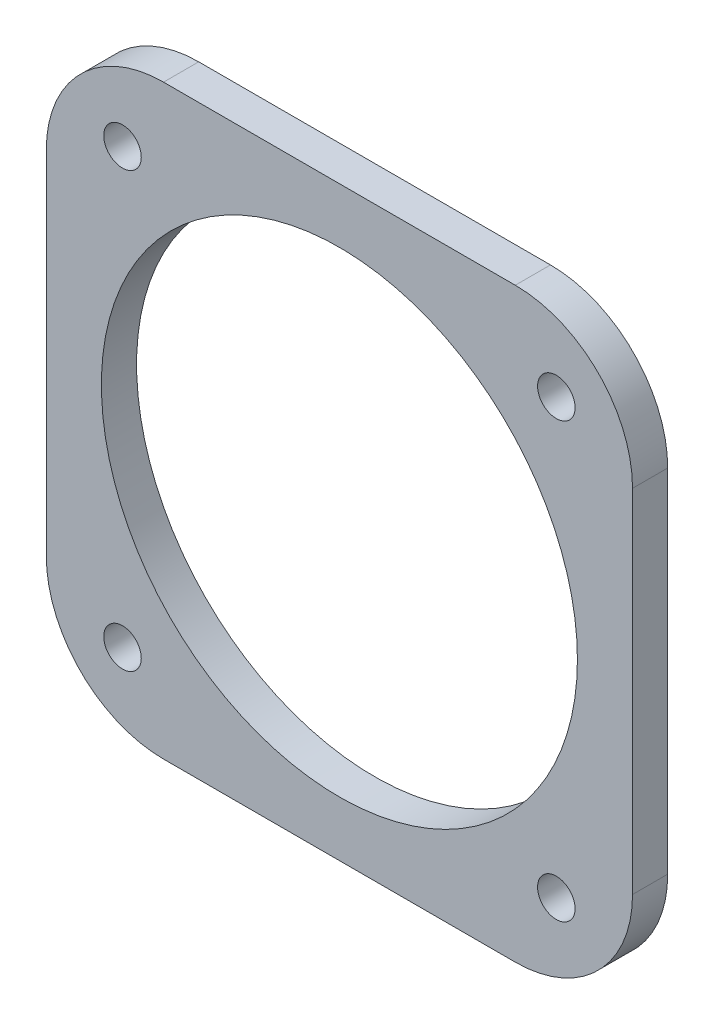
ISO-10303-21;
HEADER;
FILE_DESCRIPTION(('STEP AP214'),'2;1');
FILE_NAME('part.step','',(''),(''),'','','');
FILE_SCHEMA(('AUTOMOTIVE_DESIGN { 1 0 10303 214 1 1 1 1 }'));
ENDSEC;
DATA;
#1=APPLICATION_CONTEXT('core data for automotive mechanical design processes');
#2=APPLICATION_PROTOCOL_DEFINITION('international standard','automotive_design',2000,#1);
#3=PRODUCT_CONTEXT('',#1,'mechanical');
#4=PRODUCT('Part','Part','',(#3));
#5=PRODUCT_RELATED_PRODUCT_CATEGORY('part','',(#4));
#6=PRODUCT_DEFINITION_FORMATION('','',#4);
#7=PRODUCT_DEFINITION_CONTEXT('part definition',#1,'design');
#8=PRODUCT_DEFINITION('design','',#6,#7);
#9=PRODUCT_DEFINITION_SHAPE('','',#8);
#10=(LENGTH_UNIT() NAMED_UNIT(*) SI_UNIT(.MILLI.,.METRE.));
#11=(NAMED_UNIT(*) PLANE_ANGLE_UNIT() SI_UNIT($,.RADIAN.));
#12=(NAMED_UNIT(*) SI_UNIT($,.STERADIAN.) SOLID_ANGLE_UNIT());
#13=UNCERTAINTY_MEASURE_WITH_UNIT(LENGTH_MEASURE(1.E-05),#10,'distance_accuracy_value','');
#14=(GEOMETRIC_REPRESENTATION_CONTEXT(3) GLOBAL_UNCERTAINTY_ASSIGNED_CONTEXT((#13)) GLOBAL_UNIT_ASSIGNED_CONTEXT((#10,
#11,#12)) REPRESENTATION_CONTEXT('',''));
#15=CARTESIAN_POINT('',(0.,0.,0.));
#16=DIRECTION('',(0.,0.,1.));
#17=DIRECTION('',(1.,0.,0.));
#18=AXIS2_PLACEMENT_3D('',#15,#16,#17);
#19=CARTESIAN_POINT('',(0.,0.,3.));
#20=DIRECTION('',(0.,0.,1.));
#21=DIRECTION('',(1.,0.,0.));
#22=AXIS2_PLACEMENT_3D('',#19,#20,#21);
#23=PLANE('',#22);
#24=CARTESIAN_POINT('',(18.5000000000011,-18.499999999999,3.));
#25=DIRECTION('',(0.,0.,1.));
#26=DIRECTION('',(1.,0.,0.));
#27=AXIS2_PLACEMENT_3D('',#24,#25,#26);
#28=CIRCLE('',#27,1.6);
#29=CARTESIAN_POINT('',(20.100000000001,-18.499999999999,3.));
#30=VERTEX_POINT('',#29);
#31=EDGE_CURVE('E193',#30,#30,#28,.T.);
#32=ORIENTED_EDGE('',*,*,#31,.F.);
#33=EDGE_LOOP('',(#32));
#34=FACE_BOUND('',#33,.T.);
#35=CARTESIAN_POINT('',(-18.5,18.5,3.));
#36=DIRECTION('',(0.,0.,1.));
#37=DIRECTION('',(1.,0.,0.));
#38=AXIS2_PLACEMENT_3D('',#35,#36,#37);
#39=CIRCLE('',#38,1.6);
#40=CARTESIAN_POINT('',(-16.9,18.5,3.));
#41=VERTEX_POINT('',#40);
#42=EDGE_CURVE('E181',#41,#41,#39,.T.);
#43=ORIENTED_EDGE('',*,*,#42,.F.);
#44=EDGE_LOOP('',(#43));
#45=FACE_BOUND('',#44,.T.);
#46=DIRECTION('',(0.,1.,0.));
#47=VECTOR('',#46,1.);
#48=CARTESIAN_POINT('',(25.,25.,3.));
#49=LINE('',#48,#47);
#50=CARTESIAN_POINT('',(25.,-15.,3.));
#51=VERTEX_POINT('',#50);
#52=CARTESIAN_POINT('',(25.,15.,3.));
#53=VERTEX_POINT('',#52);
#54=EDGE_CURVE('E138',#51,#53,#49,.T.);
#55=ORIENTED_EDGE('',*,*,#54,.T.);
#56=CARTESIAN_POINT('',(15.,15.,3.));
#57=DIRECTION('',(0.,0.,1.));
#58=DIRECTION('',(1.,0.,0.));
#59=AXIS2_PLACEMENT_3D('',#56,#57,#58);
#60=CIRCLE('',#59,10.);
#61=CARTESIAN_POINT('',(15.,25.,3.));
#62=VERTEX_POINT('',#61);
#63=EDGE_CURVE('E153',#53,#62,#60,.T.);
#64=ORIENTED_EDGE('',*,*,#63,.T.);
#65=DIRECTION('',(-1.,0.,0.));
#66=VECTOR('',#65,1.);
#67=CARTESIAN_POINT('',(-25.,25.,3.));
#68=LINE('',#67,#66);
#69=CARTESIAN_POINT('',(-15.,25.,3.));
#70=VERTEX_POINT('',#69);
#71=EDGE_CURVE('E120',#62,#70,#68,.T.);
#72=ORIENTED_EDGE('',*,*,#71,.T.);
#73=CARTESIAN_POINT('',(-15.,15.,3.));
#74=DIRECTION('',(0.,0.,1.));
#75=DIRECTION('',(1.,0.,0.));
#76=AXIS2_PLACEMENT_3D('',#73,#74,#75);
#77=CIRCLE('',#76,10.);
#78=CARTESIAN_POINT('',(-25.,15.,3.));
#79=VERTEX_POINT('',#78);
#80=EDGE_CURVE('E148',#70,#79,#77,.T.);
#81=ORIENTED_EDGE('',*,*,#80,.T.);
#82=DIRECTION('',(0.,-1.,0.));
#83=VECTOR('',#82,1.);
#84=CARTESIAN_POINT('',(-25.,25.,3.));
#85=LINE('',#84,#83);
#86=CARTESIAN_POINT('',(-25.,-15.,3.));
#87=VERTEX_POINT('',#86);
#88=EDGE_CURVE('E164',#79,#87,#85,.T.);
#89=ORIENTED_EDGE('',*,*,#88,.T.);
#90=CARTESIAN_POINT('',(-15.,-15.,3.));
#91=DIRECTION('',(0.,0.,1.));
#92=DIRECTION('',(1.,0.,0.));
#93=AXIS2_PLACEMENT_3D('',#90,#91,#92);
#94=CIRCLE('',#93,10.);
#95=CARTESIAN_POINT('',(-15.,-25.,3.));
#96=VERTEX_POINT('',#95);
#97=EDGE_CURVE('E56',#87,#96,#94,.T.);
#98=ORIENTED_EDGE('',*,*,#97,.T.);
#99=DIRECTION('',(1.,0.,0.));
#100=VECTOR('',#99,1.);
#101=CARTESIAN_POINT('',(-25.,-25.,3.));
#102=LINE('',#101,#100);
#103=CARTESIAN_POINT('',(15.,-25.,3.));
#104=VERTEX_POINT('',#103);
#105=EDGE_CURVE('E139',#96,#104,#102,.T.);
#106=ORIENTED_EDGE('',*,*,#105,.T.);
#107=CARTESIAN_POINT('',(15.,-15.,3.));
#108=DIRECTION('',(0.,0.,1.));
#109=DIRECTION('',(1.,0.,0.));
#110=AXIS2_PLACEMENT_3D('',#107,#108,#109);
#111=CIRCLE('',#110,10.);
#112=EDGE_CURVE('E151',#104,#51,#111,.T.);
#113=ORIENTED_EDGE('',*,*,#112,.T.);
#114=EDGE_LOOP('',(#55,#64,#72,#81,#89,#98,#106,#113));
#115=FACE_BOUND('',#114,.T.);
#116=CARTESIAN_POINT('',(0.,0.,3.));
#117=DIRECTION('',(0.,0.,1.));
#118=DIRECTION('',(1.,0.,0.));
#119=AXIS2_PLACEMENT_3D('',#116,#117,#118);
#120=CIRCLE('',#119,20.3);
#121=CARTESIAN_POINT('',(20.3,0.,3.));
#122=VERTEX_POINT('',#121);
#123=EDGE_CURVE('E133',#122,#122,#120,.T.);
#124=ORIENTED_EDGE('',*,*,#123,.F.);
#125=EDGE_LOOP('',(#124));
#126=FACE_BOUND('',#125,.T.);
#127=CARTESIAN_POINT('',(18.5,18.500000000001,3.));
#128=DIRECTION('',(0.,0.,1.));
#129=DIRECTION('',(1.,0.,0.));
#130=AXIS2_PLACEMENT_3D('',#127,#128,#129);
#131=CIRCLE('',#130,1.6);
#132=CARTESIAN_POINT('',(20.1,18.500000000001,3.));
#133=VERTEX_POINT('',#132);
#134=EDGE_CURVE('E187',#133,#133,#131,.T.);
#135=ORIENTED_EDGE('',*,*,#134,.F.);
#136=EDGE_LOOP('',(#135));
#137=FACE_BOUND('',#136,.T.);
#138=CARTESIAN_POINT('',(-18.499999999999,-18.5,3.));
#139=DIRECTION('',(0.,0.,1.));
#140=DIRECTION('',(1.,0.,0.));
#141=AXIS2_PLACEMENT_3D('',#138,#139,#140);
#142=CIRCLE('',#141,1.6);
#143=CARTESIAN_POINT('',(-16.899999999999,-18.5,3.));
#144=VERTEX_POINT('',#143);
#145=EDGE_CURVE('E199',#144,#144,#142,.T.);
#146=ORIENTED_EDGE('',*,*,#145,.F.);
#147=EDGE_LOOP('',(#146));
#148=FACE_BOUND('',#147,.T.);
#149=ADVANCED_FACE('F34',(#34,#45,#115,#126,#137,#148),#23,.T.);
#150=CARTESIAN_POINT('',(0.,0.,0.));
#151=DIRECTION('',(0.,0.,1.));
#152=DIRECTION('',(1.,0.,0.));
#153=AXIS2_PLACEMENT_3D('',#150,#151,#152);
#154=PLANE('',#153);
#155=DIRECTION('',(-1.,0.,0.));
#156=VECTOR('',#155,1.);
#157=CARTESIAN_POINT('',(-25.,25.,0.));
#158=LINE('',#157,#156);
#159=CARTESIAN_POINT('',(15.,25.,0.));
#160=VERTEX_POINT('',#159);
#161=CARTESIAN_POINT('',(-15.,25.,0.));
#162=VERTEX_POINT('',#161);
#163=EDGE_CURVE('E117',#160,#162,#158,.T.);
#164=ORIENTED_EDGE('',*,*,#163,.F.);
#165=CARTESIAN_POINT('',(15.,15.,0.));
#166=DIRECTION('',(0.,0.,1.));
#167=DIRECTION('',(1.,0.,0.));
#168=AXIS2_PLACEMENT_3D('',#165,#166,#167);
#169=CIRCLE('',#168,10.);
#170=CARTESIAN_POINT('',(25.,15.,0.));
#171=VERTEX_POINT('',#170);
#172=EDGE_CURVE('E100',#160,#171,#169,.F.);
#173=ORIENTED_EDGE('',*,*,#172,.T.);
#174=DIRECTION('',(0.,1.,0.));
#175=VECTOR('',#174,1.);
#176=CARTESIAN_POINT('',(25.,25.,0.));
#177=LINE('',#176,#175);
#178=CARTESIAN_POINT('',(25.,-15.,0.));
#179=VERTEX_POINT('',#178);
#180=EDGE_CURVE('E128',#179,#171,#177,.T.);
#181=ORIENTED_EDGE('',*,*,#180,.F.);
#182=CARTESIAN_POINT('',(15.,-15.,0.));
#183=DIRECTION('',(0.,0.,1.));
#184=DIRECTION('',(1.,0.,0.));
#185=AXIS2_PLACEMENT_3D('',#182,#183,#184);
#186=CIRCLE('',#185,10.);
#187=CARTESIAN_POINT('',(15.,-25.,0.));
#188=VERTEX_POINT('',#187);
#189=EDGE_CURVE('E111',#179,#188,#186,.F.);
#190=ORIENTED_EDGE('',*,*,#189,.T.);
#191=DIRECTION('',(1.,0.,0.));
#192=VECTOR('',#191,1.);
#193=CARTESIAN_POINT('',(-25.,-25.,0.));
#194=LINE('',#193,#192);
#195=CARTESIAN_POINT('',(-15.,-25.,0.));
#196=VERTEX_POINT('',#195);
#197=EDGE_CURVE('E131',#196,#188,#194,.T.);
#198=ORIENTED_EDGE('',*,*,#197,.F.);
#199=CARTESIAN_POINT('',(-15.,-15.,0.));
#200=DIRECTION('',(0.,0.,1.));
#201=DIRECTION('',(1.,0.,0.));
#202=AXIS2_PLACEMENT_3D('',#199,#200,#201);
#203=CIRCLE('',#202,10.);
#204=CARTESIAN_POINT('',(-25.,-15.,0.));
#205=VERTEX_POINT('',#204);
#206=EDGE_CURVE('E142',#196,#205,#203,.F.);
#207=ORIENTED_EDGE('',*,*,#206,.T.);
#208=DIRECTION('',(0.,-1.,0.));
#209=VECTOR('',#208,1.);
#210=CARTESIAN_POINT('',(-25.,25.,0.));
#211=LINE('',#210,#209);
#212=CARTESIAN_POINT('',(-25.,15.,0.));
#213=VERTEX_POINT('',#212);
#214=EDGE_CURVE('E127',#213,#205,#211,.T.);
#215=ORIENTED_EDGE('',*,*,#214,.F.);
#216=CARTESIAN_POINT('',(-15.,15.,0.));
#217=DIRECTION('',(0.,0.,1.));
#218=DIRECTION('',(1.,0.,0.));
#219=AXIS2_PLACEMENT_3D('',#216,#217,#218);
#220=CIRCLE('',#219,10.);
#221=EDGE_CURVE('E121',#213,#162,#220,.F.);
#222=ORIENTED_EDGE('',*,*,#221,.T.);
#223=EDGE_LOOP('',(#164,#173,#181,#190,#198,#207,#215,#222));
#224=FACE_BOUND('',#223,.T.);
#225=CARTESIAN_POINT('',(0.,0.,0.));
#226=DIRECTION('',(0.,0.,1.));
#227=DIRECTION('',(1.,0.,0.));
#228=AXIS2_PLACEMENT_3D('',#225,#226,#227);
#229=CIRCLE('',#228,20.3);
#230=CARTESIAN_POINT('',(20.3,0.,0.));
#231=VERTEX_POINT('',#230);
#232=EDGE_CURVE('E178',#231,#231,#229,.T.);
#233=ORIENTED_EDGE('',*,*,#232,.T.);
#234=EDGE_LOOP('',(#233));
#235=FACE_BOUND('',#234,.T.);
#236=CARTESIAN_POINT('',(-18.5,18.5,0.));
#237=DIRECTION('',(0.,0.,1.));
#238=DIRECTION('',(1.,0.,0.));
#239=AXIS2_PLACEMENT_3D('',#236,#237,#238);
#240=CIRCLE('',#239,1.6);
#241=CARTESIAN_POINT('',(-16.9,18.5,0.));
#242=VERTEX_POINT('',#241);
#243=EDGE_CURVE('E184',#242,#242,#240,.T.);
#244=ORIENTED_EDGE('',*,*,#243,.T.);
#245=EDGE_LOOP('',(#244));
#246=FACE_BOUND('',#245,.T.);
#247=CARTESIAN_POINT('',(18.5,18.500000000001,0.));
#248=DIRECTION('',(0.,0.,1.));
#249=DIRECTION('',(1.,0.,0.));
#250=AXIS2_PLACEMENT_3D('',#247,#248,#249);
#251=CIRCLE('',#250,1.6);
#252=CARTESIAN_POINT('',(20.1,18.500000000001,0.));
#253=VERTEX_POINT('',#252);
#254=EDGE_CURVE('E190',#253,#253,#251,.T.);
#255=ORIENTED_EDGE('',*,*,#254,.T.);
#256=EDGE_LOOP('',(#255));
#257=FACE_BOUND('',#256,.T.);
#258=CARTESIAN_POINT('',(18.5000000000011,-18.499999999999,0.));
#259=DIRECTION('',(0.,0.,1.));
#260=DIRECTION('',(1.,0.,0.));
#261=AXIS2_PLACEMENT_3D('',#258,#259,#260);
#262=CIRCLE('',#261,1.6);
#263=CARTESIAN_POINT('',(20.100000000001,-18.499999999999,0.));
#264=VERTEX_POINT('',#263);
#265=EDGE_CURVE('E196',#264,#264,#262,.T.);
#266=ORIENTED_EDGE('',*,*,#265,.T.);
#267=EDGE_LOOP('',(#266));
#268=FACE_BOUND('',#267,.T.);
#269=CARTESIAN_POINT('',(-18.499999999999,-18.5,0.));
#270=DIRECTION('',(0.,0.,1.));
#271=DIRECTION('',(1.,0.,0.));
#272=AXIS2_PLACEMENT_3D('',#269,#270,#271);
#273=CIRCLE('',#272,1.6);
#274=CARTESIAN_POINT('',(-16.899999999999,-18.5,0.));
#275=VERTEX_POINT('',#274);
#276=EDGE_CURVE('E202',#275,#275,#273,.T.);
#277=ORIENTED_EDGE('',*,*,#276,.T.);
#278=EDGE_LOOP('',(#277));
#279=FACE_BOUND('',#278,.T.);
#280=ADVANCED_FACE('F124',(#224,#235,#246,#257,#268,#279),#154,.F.);
#281=CARTESIAN_POINT('',(25.,25.,3.));
#282=DIRECTION('',(-1.,0.,0.));
#283=DIRECTION('',(0.,-1.,0.));
#284=AXIS2_PLACEMENT_3D('',#281,#282,#283);
#285=PLANE('',#284);
#286=ORIENTED_EDGE('',*,*,#180,.T.);
#287=DIRECTION('',(0.,0.,-1.));
#288=VECTOR('',#287,1.);
#289=CARTESIAN_POINT('',(25.,15.,3.));
#290=LINE('',#289,#288);
#291=EDGE_CURVE('E105',#171,#53,#290,.F.);
#292=ORIENTED_EDGE('',*,*,#291,.T.);
#293=ORIENTED_EDGE('',*,*,#54,.F.);
#294=DIRECTION('',(0.,0.,-1.));
#295=VECTOR('',#294,1.);
#296=CARTESIAN_POINT('',(25.,-15.,3.));
#297=LINE('',#296,#295);
#298=EDGE_CURVE('E110',#51,#179,#297,.T.);
#299=ORIENTED_EDGE('',*,*,#298,.T.);
#300=EDGE_LOOP('',(#286,#292,#293,#299));
#301=FACE_BOUND('',#300,.T.);
#302=ADVANCED_FACE('F217',(#301),#285,.F.);
#303=CARTESIAN_POINT('',(-25.,25.,3.));
#304=DIRECTION('',(0.,-1.,0.));
#305=DIRECTION('',(0.,0.,-1.));
#306=AXIS2_PLACEMENT_3D('',#303,#304,#305);
#307=PLANE('',#306);
#308=ORIENTED_EDGE('',*,*,#71,.F.);
#309=DIRECTION('',(0.,0.,-1.));
#310=VECTOR('',#309,1.);
#311=CARTESIAN_POINT('',(15.,25.,3.));
#312=LINE('',#311,#310);
#313=EDGE_CURVE('E104',#62,#160,#312,.T.);
#314=ORIENTED_EDGE('',*,*,#313,.T.);
#315=ORIENTED_EDGE('',*,*,#163,.T.);
#316=DIRECTION('',(0.,0.,-1.));
#317=VECTOR('',#316,1.);
#318=CARTESIAN_POINT('',(-15.,25.,3.));
#319=LINE('',#318,#317);
#320=EDGE_CURVE('E122',#162,#70,#319,.F.);
#321=ORIENTED_EDGE('',*,*,#320,.T.);
#322=EDGE_LOOP('',(#308,#314,#315,#321));
#323=FACE_BOUND('',#322,.T.);
#324=ADVANCED_FACE('F116',(#323),#307,.F.);
#325=CARTESIAN_POINT('',(-25.,25.,3.));
#326=DIRECTION('',(1.,0.,0.));
#327=DIRECTION('',(0.,1.,0.));
#328=AXIS2_PLACEMENT_3D('',#325,#326,#327);
#329=PLANE('',#328);
#330=ORIENTED_EDGE('',*,*,#214,.T.);
#331=DIRECTION('',(0.,0.,-1.));
#332=VECTOR('',#331,1.);
#333=CARTESIAN_POINT('',(-25.,-15.,3.));
#334=LINE('',#333,#332);
#335=EDGE_CURVE('E11',#205,#87,#334,.F.);
#336=ORIENTED_EDGE('',*,*,#335,.T.);
#337=ORIENTED_EDGE('',*,*,#88,.F.);
#338=DIRECTION('',(0.,0.,-1.));
#339=VECTOR('',#338,1.);
#340=CARTESIAN_POINT('',(-25.,15.,3.));
#341=LINE('',#340,#339);
#342=EDGE_CURVE('E42',#79,#213,#341,.T.);
#343=ORIENTED_EDGE('',*,*,#342,.T.);
#344=EDGE_LOOP('',(#330,#336,#337,#343));
#345=FACE_BOUND('',#344,.T.);
#346=ADVANCED_FACE('F162',(#345),#329,.F.);
#347=CARTESIAN_POINT('',(-25.,-25.,3.));
#348=DIRECTION('',(0.,1.,0.));
#349=DIRECTION('',(0.,0.,1.));
#350=AXIS2_PLACEMENT_3D('',#347,#348,#349);
#351=PLANE('',#350);
#352=ORIENTED_EDGE('',*,*,#197,.T.);
#353=DIRECTION('',(0.,0.,-1.));
#354=VECTOR('',#353,1.);
#355=CARTESIAN_POINT('',(15.,-25.,3.));
#356=LINE('',#355,#354);
#357=EDGE_CURVE('E49',#188,#104,#356,.F.);
#358=ORIENTED_EDGE('',*,*,#357,.T.);
#359=ORIENTED_EDGE('',*,*,#105,.F.);
#360=DIRECTION('',(0.,0.,-1.));
#361=VECTOR('',#360,1.);
#362=CARTESIAN_POINT('',(-15.,-25.,3.));
#363=LINE('',#362,#361);
#364=EDGE_CURVE('E155',#96,#196,#363,.T.);
#365=ORIENTED_EDGE('',*,*,#364,.T.);
#366=EDGE_LOOP('',(#352,#358,#359,#365));
#367=FACE_BOUND('',#366,.T.);
#368=ADVANCED_FACE('F171',(#367),#351,.F.);
#369=CARTESIAN_POINT('',(0.,0.,3.));
#370=DIRECTION('',(0.,0.,-1.));
#371=DIRECTION('',(-1.,0.,0.));
#372=AXIS2_PLACEMENT_3D('',#369,#370,#371);
#373=CYLINDRICAL_SURFACE('',#372,20.3);
#374=ORIENTED_EDGE('',*,*,#123,.T.);
#375=EDGE_LOOP('',(#374));
#376=FACE_BOUND('',#375,.T.);
#377=ORIENTED_EDGE('',*,*,#232,.F.);
#378=EDGE_LOOP('',(#377));
#379=FACE_BOUND('',#378,.T.);
#380=ADVANCED_FACE('F222',(#376,#379),#373,.F.);
#381=CARTESIAN_POINT('',(-18.5,18.5,3.));
#382=DIRECTION('',(0.,0.,-1.));
#383=DIRECTION('',(-1.,0.,0.));
#384=AXIS2_PLACEMENT_3D('',#381,#382,#383);
#385=CYLINDRICAL_SURFACE('',#384,1.6);
#386=ORIENTED_EDGE('',*,*,#42,.T.);
#387=EDGE_LOOP('',(#386));
#388=FACE_BOUND('',#387,.T.);
#389=ORIENTED_EDGE('',*,*,#243,.F.);
#390=EDGE_LOOP('',(#389));
#391=FACE_BOUND('',#390,.T.);
#392=ADVANCED_FACE('F256',(#388,#391),#385,.F.);
#393=CARTESIAN_POINT('',(18.5,18.500000000001,3.));
#394=DIRECTION('',(0.,0.,-1.));
#395=DIRECTION('',(-1.,0.,0.));
#396=AXIS2_PLACEMENT_3D('',#393,#394,#395);
#397=CYLINDRICAL_SURFACE('',#396,1.6);
#398=ORIENTED_EDGE('',*,*,#134,.T.);
#399=EDGE_LOOP('',(#398));
#400=FACE_BOUND('',#399,.T.);
#401=ORIENTED_EDGE('',*,*,#254,.F.);
#402=EDGE_LOOP('',(#401));
#403=FACE_BOUND('',#402,.T.);
#404=ADVANCED_FACE('F252',(#400,#403),#397,.F.);
#405=CARTESIAN_POINT('',(18.5000000000011,-18.499999999999,3.));
#406=DIRECTION('',(0.,0.,-1.));
#407=DIRECTION('',(-1.,0.,0.));
#408=AXIS2_PLACEMENT_3D('',#405,#406,#407);
#409=CYLINDRICAL_SURFACE('',#408,1.6);
#410=ORIENTED_EDGE('',*,*,#31,.T.);
#411=EDGE_LOOP('',(#410));
#412=FACE_BOUND('',#411,.T.);
#413=ORIENTED_EDGE('',*,*,#265,.F.);
#414=EDGE_LOOP('',(#413));
#415=FACE_BOUND('',#414,.T.);
#416=ADVANCED_FACE('F255',(#412,#415),#409,.F.);
#417=CARTESIAN_POINT('',(-18.499999999999,-18.5,3.));
#418=DIRECTION('',(0.,0.,-1.));
#419=DIRECTION('',(-1.,0.,0.));
#420=AXIS2_PLACEMENT_3D('',#417,#418,#419);
#421=CYLINDRICAL_SURFACE('',#420,1.6);
#422=ORIENTED_EDGE('',*,*,#145,.T.);
#423=EDGE_LOOP('',(#422));
#424=FACE_BOUND('',#423,.T.);
#425=ORIENTED_EDGE('',*,*,#276,.F.);
#426=EDGE_LOOP('',(#425));
#427=FACE_BOUND('',#426,.T.);
#428=ADVANCED_FACE('F208',(#424,#427),#421,.F.);
#429=CARTESIAN_POINT('',(15.,15.,3.));
#430=DIRECTION('',(0.,0.,-1.));
#431=DIRECTION('',(-1.,0.,0.));
#432=AXIS2_PLACEMENT_3D('',#429,#430,#431);
#433=CYLINDRICAL_SURFACE('',#432,10.);
#434=ORIENTED_EDGE('',*,*,#63,.F.);
#435=ORIENTED_EDGE('',*,*,#291,.F.);
#436=ORIENTED_EDGE('',*,*,#172,.F.);
#437=ORIENTED_EDGE('',*,*,#313,.F.);
#438=EDGE_LOOP('',(#434,#435,#436,#437));
#439=FACE_BOUND('',#438,.T.);
#440=ADVANCED_FACE('F103',(#439),#433,.T.);
#441=CARTESIAN_POINT('',(15.,-15.,3.));
#442=DIRECTION('',(0.,0.,-1.));
#443=DIRECTION('',(-1.,0.,0.));
#444=AXIS2_PLACEMENT_3D('',#441,#442,#443);
#445=CYLINDRICAL_SURFACE('',#444,10.);
#446=ORIENTED_EDGE('',*,*,#112,.F.);
#447=ORIENTED_EDGE('',*,*,#357,.F.);
#448=ORIENTED_EDGE('',*,*,#189,.F.);
#449=ORIENTED_EDGE('',*,*,#298,.F.);
#450=EDGE_LOOP('',(#446,#447,#448,#449));
#451=FACE_BOUND('',#450,.T.);
#452=ADVANCED_FACE('F236',(#451),#445,.T.);
#453=CARTESIAN_POINT('',(-15.,-15.,3.));
#454=DIRECTION('',(0.,0.,-1.));
#455=DIRECTION('',(-1.,0.,0.));
#456=AXIS2_PLACEMENT_3D('',#453,#454,#455);
#457=CYLINDRICAL_SURFACE('',#456,10.);
#458=ORIENTED_EDGE('',*,*,#97,.F.);
#459=ORIENTED_EDGE('',*,*,#335,.F.);
#460=ORIENTED_EDGE('',*,*,#206,.F.);
#461=ORIENTED_EDGE('',*,*,#364,.F.);
#462=EDGE_LOOP('',(#458,#459,#460,#461));
#463=FACE_BOUND('',#462,.T.);
#464=ADVANCED_FACE('F170',(#463),#457,.T.);
#465=CARTESIAN_POINT('',(-15.,15.,3.));
#466=DIRECTION('',(0.,0.,-1.));
#467=DIRECTION('',(-1.,0.,0.));
#468=AXIS2_PLACEMENT_3D('',#465,#466,#467);
#469=CYLINDRICAL_SURFACE('',#468,10.);
#470=ORIENTED_EDGE('',*,*,#80,.F.);
#471=ORIENTED_EDGE('',*,*,#320,.F.);
#472=ORIENTED_EDGE('',*,*,#221,.F.);
#473=ORIENTED_EDGE('',*,*,#342,.F.);
#474=EDGE_LOOP('',(#470,#471,#472,#473));
#475=FACE_BOUND('',#474,.T.);
#476=ADVANCED_FACE('F36',(#475),#469,.T.);
#477=CLOSED_SHELL('',(#149,#280,#302,#324,#346,#368,#380,#392,#404,#416,#428,#440,#452,#464,#476));
#478=MANIFOLD_SOLID_BREP('B2',#477);
#479=ADVANCED_BREP_SHAPE_REPRESENTATION('',(#18,#478),#14);
#480=SHAPE_DEFINITION_REPRESENTATION(#9,#479);
ENDSEC;
END-ISO-10303-21;
